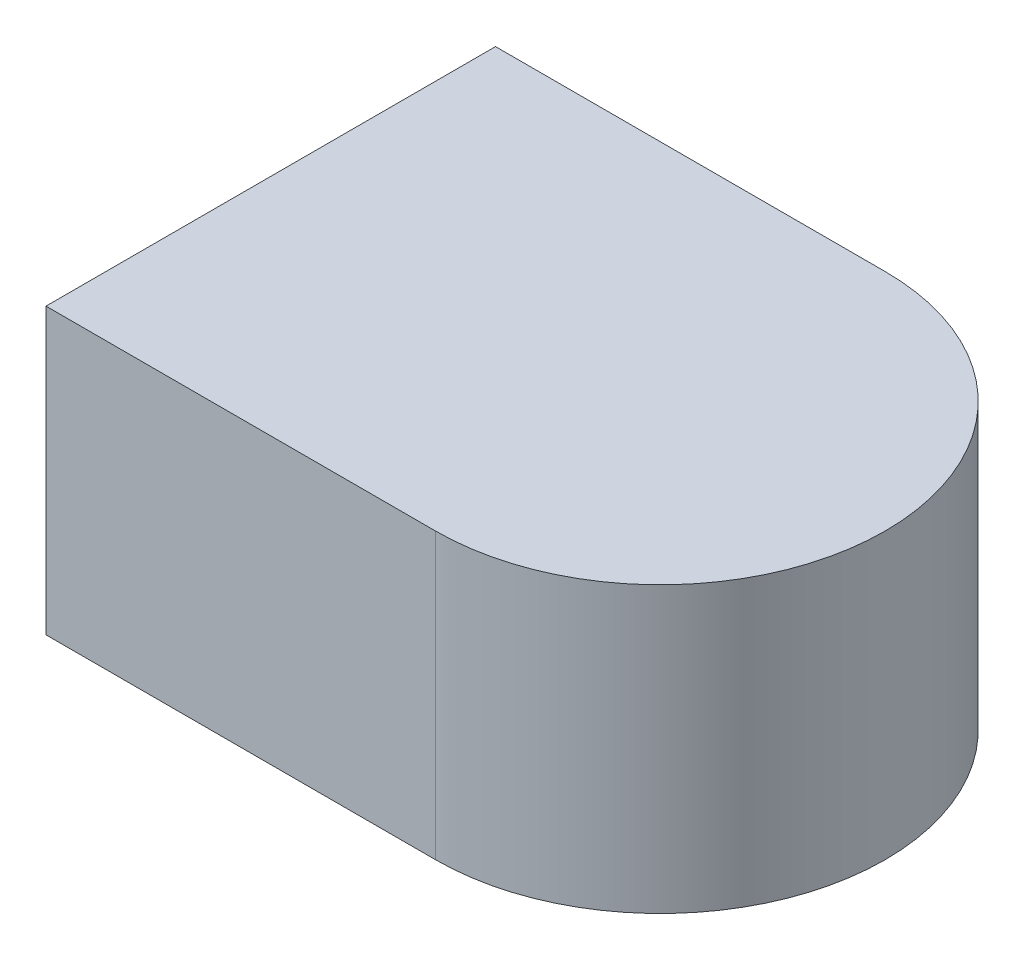
ISO-10303-21;
HEADER;
FILE_DESCRIPTION(('STEP AP214'),'2;1');
FILE_NAME('part.step','',(''),(''),'','','');
FILE_SCHEMA(('AUTOMOTIVE_DESIGN { 1 0 10303 214 1 1 1 1 }'));
ENDSEC;
DATA;
#1=APPLICATION_CONTEXT('core data for automotive mechanical design processes');
#2=APPLICATION_PROTOCOL_DEFINITION('international standard','automotive_design',2000,#1);
#3=PRODUCT_CONTEXT('',#1,'mechanical');
#4=PRODUCT('Part','Part','',(#3));
#5=PRODUCT_RELATED_PRODUCT_CATEGORY('part','',(#4));
#6=PRODUCT_DEFINITION_FORMATION('','',#4);
#7=PRODUCT_DEFINITION_CONTEXT('part definition',#1,'design');
#8=PRODUCT_DEFINITION('design','',#6,#7);
#9=PRODUCT_DEFINITION_SHAPE('','',#8);
#10=(LENGTH_UNIT() NAMED_UNIT(*) SI_UNIT(.MILLI.,.METRE.));
#11=(NAMED_UNIT(*) PLANE_ANGLE_UNIT() SI_UNIT($,.RADIAN.));
#12=(NAMED_UNIT(*) SI_UNIT($,.STERADIAN.) SOLID_ANGLE_UNIT());
#13=UNCERTAINTY_MEASURE_WITH_UNIT(LENGTH_MEASURE(1.E-05),#10,'distance_accuracy_value','');
#14=(GEOMETRIC_REPRESENTATION_CONTEXT(3) GLOBAL_UNCERTAINTY_ASSIGNED_CONTEXT((#13)) GLOBAL_UNIT_ASSIGNED_CONTEXT((#10,
#11,#12)) REPRESENTATION_CONTEXT('',''));
#15=CARTESIAN_POINT('',(0.,0.,0.));
#16=DIRECTION('',(0.,0.,1.));
#17=DIRECTION('',(1.,0.,0.));
#18=AXIS2_PLACEMENT_3D('',#15,#16,#17);
#19=CARTESIAN_POINT('',(0.,0.,0.));
#20=DIRECTION('',(0.,1.,0.));
#21=DIRECTION('',(1.,0.,0.));
#22=AXIS2_PLACEMENT_3D('',#19,#20,#21);
#23=PLANE('',#22);
#24=CARTESIAN_POINT('',(0.,0.,0.));
#25=DIRECTION('',(0.,1.,0.));
#26=DIRECTION('',(0.,0.,1.));
#27=AXIS2_PLACEMENT_3D('',#24,#25,#26);
#28=CIRCLE('',#27,15.);
#29=CARTESIAN_POINT('',(0.,0.,15.));
#30=VERTEX_POINT('',#29);
#31=CARTESIAN_POINT('',(0.,0.,-15.));
#32=VERTEX_POINT('',#31);
#33=EDGE_CURVE('E11',#30,#32,#28,.T.);
#34=ORIENTED_EDGE('',*,*,#33,.F.);
#35=DIRECTION('',(1.,0.,0.));
#36=VECTOR('',#35,1.);
#37=CARTESIAN_POINT('',(0.,0.,15.));
#38=LINE('',#37,#36);
#39=CARTESIAN_POINT('',(-26.,0.,15.));
#40=VERTEX_POINT('',#39);
#41=EDGE_CURVE('E110',#40,#30,#38,.T.);
#42=ORIENTED_EDGE('',*,*,#41,.F.);
#43=DIRECTION('',(0.,0.,1.));
#44=VECTOR('',#43,1.);
#45=CARTESIAN_POINT('',(-26.,0.,15.));
#46=LINE('',#45,#44);
#47=CARTESIAN_POINT('',(-26.,0.,-15.));
#48=VERTEX_POINT('',#47);
#49=EDGE_CURVE('E80',#48,#40,#46,.T.);
#50=ORIENTED_EDGE('',*,*,#49,.F.);
#51=DIRECTION('',(-1.,0.,0.));
#52=VECTOR('',#51,1.);
#53=CARTESIAN_POINT('',(-26.,0.,-15.));
#54=LINE('',#53,#52);
#55=EDGE_CURVE('E25',#32,#48,#54,.T.);
#56=ORIENTED_EDGE('',*,*,#55,.F.);
#57=EDGE_LOOP('',(#34,#42,#50,#56));
#58=FACE_BOUND('',#57,.T.);
#59=ADVANCED_FACE('F16',(#58),#23,.F.);
#60=CARTESIAN_POINT('',(0.,0.,0.));
#61=DIRECTION('',(0.,1.,0.));
#62=DIRECTION('',(0.,0.,1.));
#63=AXIS2_PLACEMENT_3D('',#60,#61,#62);
#64=CYLINDRICAL_SURFACE('',#63,15.);
#65=DIRECTION('',(0.,1.,0.));
#66=VECTOR('',#65,1.);
#67=CARTESIAN_POINT('',(0.,0.,15.));
#68=LINE('',#67,#66);
#69=CARTESIAN_POINT('',(0.,19.,15.));
#70=VERTEX_POINT('',#69);
#71=EDGE_CURVE('E105',#30,#70,#68,.T.);
#72=ORIENTED_EDGE('',*,*,#71,.F.);
#73=ORIENTED_EDGE('',*,*,#33,.T.);
#74=DIRECTION('',(0.,-1.,0.));
#75=VECTOR('',#74,1.);
#76=CARTESIAN_POINT('',(0.,0.,-15.));
#77=LINE('',#76,#75);
#78=CARTESIAN_POINT('',(0.,19.,-15.));
#79=VERTEX_POINT('',#78);
#80=EDGE_CURVE('E19',#79,#32,#77,.T.);
#81=ORIENTED_EDGE('',*,*,#80,.F.);
#82=CARTESIAN_POINT('',(0.,19.,0.));
#83=DIRECTION('',(0.,1.,0.));
#84=DIRECTION('',(0.,0.,1.));
#85=AXIS2_PLACEMENT_3D('',#82,#83,#84);
#86=CIRCLE('',#85,15.);
#87=EDGE_CURVE('E72',#70,#79,#86,.T.);
#88=ORIENTED_EDGE('',*,*,#87,.F.);
#89=EDGE_LOOP('',(#72,#73,#81,#88));
#90=FACE_BOUND('',#89,.T.);
#91=ADVANCED_FACE('F71',(#90),#64,.T.);
#92=CARTESIAN_POINT('',(-26.,0.,-15.));
#93=DIRECTION('',(0.,0.,-1.));
#94=DIRECTION('',(0.,-1.,0.));
#95=AXIS2_PLACEMENT_3D('',#92,#93,#94);
#96=PLANE('',#95);
#97=ORIENTED_EDGE('',*,*,#80,.T.);
#98=ORIENTED_EDGE('',*,*,#55,.T.);
#99=DIRECTION('',(0.,-1.,0.));
#100=VECTOR('',#99,1.);
#101=CARTESIAN_POINT('',(-26.,0.,-15.));
#102=LINE('',#101,#100);
#103=CARTESIAN_POINT('',(-26.,19.,-15.));
#104=VERTEX_POINT('',#103);
#105=EDGE_CURVE('E85',#104,#48,#102,.T.);
#106=ORIENTED_EDGE('',*,*,#105,.F.);
#107=DIRECTION('',(-1.,0.,0.));
#108=VECTOR('',#107,1.);
#109=CARTESIAN_POINT('',(0.,19.,-15.));
#110=LINE('',#109,#108);
#111=EDGE_CURVE('E78',#79,#104,#110,.T.);
#112=ORIENTED_EDGE('',*,*,#111,.F.);
#113=EDGE_LOOP('',(#97,#98,#106,#112));
#114=FACE_BOUND('',#113,.T.);
#115=ADVANCED_FACE('F79',(#114),#96,.T.);
#116=CARTESIAN_POINT('',(-26.,0.,15.));
#117=DIRECTION('',(-1.,0.,0.));
#118=DIRECTION('',(0.,0.,1.));
#119=AXIS2_PLACEMENT_3D('',#116,#117,#118);
#120=PLANE('',#119);
#121=ORIENTED_EDGE('',*,*,#105,.T.);
#122=ORIENTED_EDGE('',*,*,#49,.T.);
#123=DIRECTION('',(0.,-1.,0.));
#124=VECTOR('',#123,1.);
#125=CARTESIAN_POINT('',(-26.,0.,15.));
#126=LINE('',#125,#124);
#127=CARTESIAN_POINT('',(-26.,19.,15.));
#128=VERTEX_POINT('',#127);
#129=EDGE_CURVE('E87',#128,#40,#126,.T.);
#130=ORIENTED_EDGE('',*,*,#129,.F.);
#131=DIRECTION('',(0.,0.,1.));
#132=VECTOR('',#131,1.);
#133=CARTESIAN_POINT('',(-26.,19.,0.));
#134=LINE('',#133,#132);
#135=EDGE_CURVE('E100',#104,#128,#134,.T.);
#136=ORIENTED_EDGE('',*,*,#135,.F.);
#137=EDGE_LOOP('',(#121,#122,#130,#136));
#138=FACE_BOUND('',#137,.T.);
#139=ADVANCED_FACE('F118',(#138),#120,.T.);
#140=CARTESIAN_POINT('',(0.,0.,15.));
#141=DIRECTION('',(0.,0.,1.));
#142=DIRECTION('',(1.,0.,0.));
#143=AXIS2_PLACEMENT_3D('',#140,#141,#142);
#144=PLANE('',#143);
#145=ORIENTED_EDGE('',*,*,#129,.T.);
#146=ORIENTED_EDGE('',*,*,#41,.T.);
#147=ORIENTED_EDGE('',*,*,#71,.T.);
#148=DIRECTION('',(1.,0.,0.));
#149=VECTOR('',#148,1.);
#150=CARTESIAN_POINT('',(0.,19.,15.));
#151=LINE('',#150,#149);
#152=EDGE_CURVE('E93',#128,#70,#151,.T.);
#153=ORIENTED_EDGE('',*,*,#152,.F.);
#154=EDGE_LOOP('',(#145,#146,#147,#153));
#155=FACE_BOUND('',#154,.T.);
#156=ADVANCED_FACE('F125',(#155),#144,.T.);
#157=CARTESIAN_POINT('',(0.,19.,0.));
#158=DIRECTION('',(0.,1.,0.));
#159=DIRECTION('',(1.,0.,0.));
#160=AXIS2_PLACEMENT_3D('',#157,#158,#159);
#161=PLANE('',#160);
#162=ORIENTED_EDGE('',*,*,#135,.T.);
#163=ORIENTED_EDGE('',*,*,#152,.T.);
#164=ORIENTED_EDGE('',*,*,#87,.T.);
#165=ORIENTED_EDGE('',*,*,#111,.T.);
#166=EDGE_LOOP('',(#162,#163,#164,#165));
#167=FACE_BOUND('',#166,.T.);
#168=ADVANCED_FACE('F90',(#167),#161,.T.);
#169=CLOSED_SHELL('',(#59,#91,#115,#139,#156,#168));
#170=MANIFOLD_SOLID_BREP('B1',#169);
#171=ADVANCED_BREP_SHAPE_REPRESENTATION('',(#18,#170),#14);
#172=SHAPE_DEFINITION_REPRESENTATION(#9,#171);
ENDSEC;
END-ISO-10303-21;
